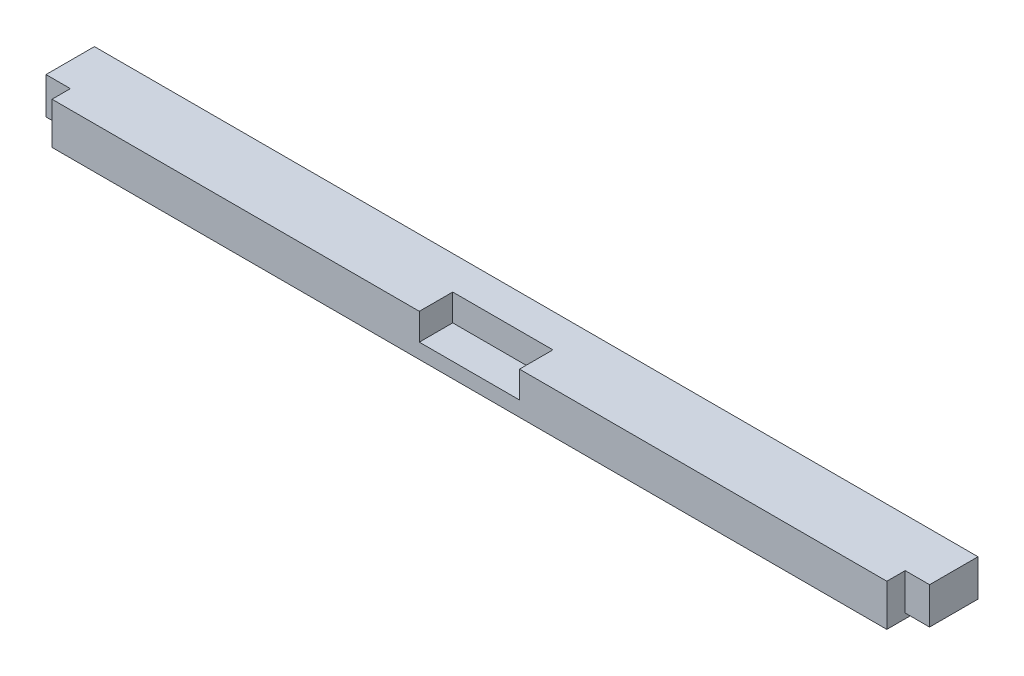
ISO-10303-21;
HEADER;
FILE_DESCRIPTION(('STEP AP214'),'2;1');
FILE_NAME('part.step','',(''),(''),'','','');
FILE_SCHEMA(('AUTOMOTIVE_DESIGN { 1 0 10303 214 1 1 1 1 }'));
ENDSEC;
DATA;
#1=APPLICATION_CONTEXT('core data for automotive mechanical design processes');
#2=APPLICATION_PROTOCOL_DEFINITION('international standard','automotive_design',2000,#1);
#3=PRODUCT_CONTEXT('',#1,'mechanical');
#4=PRODUCT('Part','Part','',(#3));
#5=PRODUCT_RELATED_PRODUCT_CATEGORY('part','',(#4));
#6=PRODUCT_DEFINITION_FORMATION('','',#4);
#7=PRODUCT_DEFINITION_CONTEXT('part definition',#1,'design');
#8=PRODUCT_DEFINITION('design','',#6,#7);
#9=PRODUCT_DEFINITION_SHAPE('','',#8);
#10=(LENGTH_UNIT() NAMED_UNIT(*) SI_UNIT(.MILLI.,.METRE.));
#11=(NAMED_UNIT(*) PLANE_ANGLE_UNIT() SI_UNIT($,.RADIAN.));
#12=(NAMED_UNIT(*) SI_UNIT($,.STERADIAN.) SOLID_ANGLE_UNIT());
#13=UNCERTAINTY_MEASURE_WITH_UNIT(LENGTH_MEASURE(1.E-05),#10,'distance_accuracy_value','');
#14=(GEOMETRIC_REPRESENTATION_CONTEXT(3) GLOBAL_UNCERTAINTY_ASSIGNED_CONTEXT((#13)) GLOBAL_UNIT_ASSIGNED_CONTEXT((#10,
#11,#12)) REPRESENTATION_CONTEXT('',''));
#15=CARTESIAN_POINT('',(0.,0.,0.));
#16=DIRECTION('',(0.,0.,1.));
#17=DIRECTION('',(1.,0.,0.));
#18=AXIS2_PLACEMENT_3D('',#15,#16,#17);
#19=CARTESIAN_POINT('',(0.,31.75,-50.8));
#20=DIRECTION('',(1.,0.,0.));
#21=DIRECTION('',(0.,0.,-1.));
#22=AXIS2_PLACEMENT_3D('',#19,#20,#21);
#23=PLANE('',#22);
#24=DIRECTION('',(0.,1.,0.));
#25=VECTOR('',#24,1.);
#26=CARTESIAN_POINT('',(0.,31.75,-13.97));
#27=LINE('',#26,#25);
#28=CARTESIAN_POINT('',(0.,3.81,-13.97));
#29=VERTEX_POINT('',#28);
#30=CARTESIAN_POINT('',(0.,31.75,-13.97));
#31=VERTEX_POINT('',#30);
#32=EDGE_CURVE('E176',#29,#31,#27,.T.);
#33=ORIENTED_EDGE('',*,*,#32,.F.);
#34=DIRECTION('',(0.,0.,1.));
#35=VECTOR('',#34,1.);
#36=CARTESIAN_POINT('',(0.,3.81,-50.8));
#37=LINE('',#36,#35);
#38=CARTESIAN_POINT('',(0.,3.81,-50.8));
#39=VERTEX_POINT('',#38);
#40=EDGE_CURVE('E55',#39,#29,#37,.T.);
#41=ORIENTED_EDGE('',*,*,#40,.F.);
#42=DIRECTION('',(0.,-1.,0.));
#43=VECTOR('',#42,1.);
#44=CARTESIAN_POINT('',(0.,31.75,-50.8));
#45=LINE('',#44,#43);
#46=CARTESIAN_POINT('',(0.,0.,-50.8));
#47=VERTEX_POINT('',#46);
#48=EDGE_CURVE('E231',#39,#47,#45,.T.);
#49=ORIENTED_EDGE('',*,*,#48,.T.);
#50=DIRECTION('',(0.,0.,1.));
#51=VECTOR('',#50,1.);
#52=CARTESIAN_POINT('',(0.,0.,-50.8));
#53=LINE('',#52,#51);
#54=CARTESIAN_POINT('',(0.,0.,0.));
#55=VERTEX_POINT('',#54);
#56=EDGE_CURVE('E219',#47,#55,#53,.T.);
#57=ORIENTED_EDGE('',*,*,#56,.T.);
#58=DIRECTION('',(0.,-1.,0.));
#59=VECTOR('',#58,1.);
#60=CARTESIAN_POINT('',(0.,31.75,0.));
#61=LINE('',#60,#59);
#62=CARTESIAN_POINT('',(0.,31.75,0.));
#63=VERTEX_POINT('',#62);
#64=EDGE_CURVE('E11',#63,#55,#61,.T.);
#65=ORIENTED_EDGE('',*,*,#64,.F.);
#66=DIRECTION('',(0.,0.,1.));
#67=VECTOR('',#66,1.);
#68=CARTESIAN_POINT('',(0.,31.75,-50.8));
#69=LINE('',#68,#67);
#70=EDGE_CURVE('E220',#31,#63,#69,.T.);
#71=ORIENTED_EDGE('',*,*,#70,.F.);
#72=EDGE_LOOP('',(#33,#41,#49,#57,#65,#71));
#73=FACE_BOUND('',#72,.T.);
#74=ADVANCED_FACE('F33',(#73),#23,.F.);
#75=CARTESIAN_POINT('',(635.,31.75,-50.8));
#76=DIRECTION('',(-1.,0.,0.));
#77=DIRECTION('',(0.,0.,1.));
#78=AXIS2_PLACEMENT_3D('',#75,#76,#77);
#79=PLANE('',#78);
#80=DIRECTION('',(0.,0.,-1.));
#81=VECTOR('',#80,1.);
#82=CARTESIAN_POINT('',(635.,3.81,-50.8));
#83=LINE('',#82,#81);
#84=CARTESIAN_POINT('',(635.,3.81,-13.97));
#85=VERTEX_POINT('',#84);
#86=CARTESIAN_POINT('',(635.,3.81,-50.8));
#87=VERTEX_POINT('',#86);
#88=EDGE_CURVE('E200',#85,#87,#83,.T.);
#89=ORIENTED_EDGE('',*,*,#88,.F.);
#90=DIRECTION('',(0.,-1.,0.));
#91=VECTOR('',#90,1.);
#92=CARTESIAN_POINT('',(635.,31.75,-13.97));
#93=LINE('',#92,#91);
#94=CARTESIAN_POINT('',(635.,31.75,-13.97));
#95=VERTEX_POINT('',#94);
#96=EDGE_CURVE('E195',#95,#85,#93,.T.);
#97=ORIENTED_EDGE('',*,*,#96,.F.);
#98=DIRECTION('',(0.,0.,-1.));
#99=VECTOR('',#98,1.);
#100=CARTESIAN_POINT('',(635.,31.75,-50.8));
#101=LINE('',#100,#99);
#102=CARTESIAN_POINT('',(635.,31.75,0.));
#103=VERTEX_POINT('',#102);
#104=EDGE_CURVE('E226',#103,#95,#101,.T.);
#105=ORIENTED_EDGE('',*,*,#104,.F.);
#106=DIRECTION('',(0.,-1.,0.));
#107=VECTOR('',#106,1.);
#108=CARTESIAN_POINT('',(635.,31.75,0.));
#109=LINE('',#108,#107);
#110=CARTESIAN_POINT('',(635.,0.,0.));
#111=VERTEX_POINT('',#110);
#112=EDGE_CURVE('E40',#103,#111,#109,.T.);
#113=ORIENTED_EDGE('',*,*,#112,.T.);
#114=DIRECTION('',(0.,0.,-1.));
#115=VECTOR('',#114,1.);
#116=CARTESIAN_POINT('',(635.,0.,-50.8));
#117=LINE('',#116,#115);
#118=CARTESIAN_POINT('',(635.,0.,-50.8));
#119=VERTEX_POINT('',#118);
#120=EDGE_CURVE('E236',#111,#119,#117,.T.);
#121=ORIENTED_EDGE('',*,*,#120,.T.);
#122=DIRECTION('',(0.,-1.,0.));
#123=VECTOR('',#122,1.);
#124=CARTESIAN_POINT('',(635.,31.75,-50.8));
#125=LINE('',#124,#123);
#126=EDGE_CURVE('E242',#87,#119,#125,.T.);
#127=ORIENTED_EDGE('',*,*,#126,.F.);
#128=EDGE_LOOP('',(#89,#97,#105,#113,#121,#127));
#129=FACE_BOUND('',#128,.T.);
#130=ADVANCED_FACE('F248',(#129),#79,.F.);
#131=CARTESIAN_POINT('',(0.,31.75,0.));
#132=DIRECTION('',(0.,0.,-1.));
#133=DIRECTION('',(-1.,0.,0.));
#134=AXIS2_PLACEMENT_3D('',#131,#132,#133);
#135=PLANE('',#134);
#136=DIRECTION('',(1.,0.,0.));
#137=VECTOR('',#136,1.);
#138=CARTESIAN_POINT('',(355.6,11.43,0.));
#139=LINE('',#138,#137);
#140=CARTESIAN_POINT('',(279.4,11.43,0.));
#141=VERTEX_POINT('',#140);
#142=CARTESIAN_POINT('',(355.6,11.43,0.));
#143=VERTEX_POINT('',#142);
#144=EDGE_CURVE('E151',#141,#143,#139,.T.);
#145=ORIENTED_EDGE('',*,*,#144,.F.);
#146=DIRECTION('',(0.,1.,0.));
#147=VECTOR('',#146,1.);
#148=CARTESIAN_POINT('',(279.4,11.43,0.));
#149=LINE('',#148,#147);
#150=CARTESIAN_POINT('',(279.4,31.75,0.));
#151=VERTEX_POINT('',#150);
#152=EDGE_CURVE('E134',#141,#151,#149,.T.);
#153=ORIENTED_EDGE('',*,*,#152,.T.);
#154=DIRECTION('',(1.,0.,0.));
#155=VECTOR('',#154,1.);
#156=CARTESIAN_POINT('',(0.,31.75,0.));
#157=LINE('',#156,#155);
#158=EDGE_CURVE('E224',#63,#151,#157,.T.);
#159=ORIENTED_EDGE('',*,*,#158,.F.);
#160=ORIENTED_EDGE('',*,*,#64,.T.);
#161=DIRECTION('',(1.,0.,0.));
#162=VECTOR('',#161,1.);
#163=CARTESIAN_POINT('',(0.,0.,0.));
#164=LINE('',#163,#162);
#165=EDGE_CURVE('E234',#55,#111,#164,.T.);
#166=ORIENTED_EDGE('',*,*,#165,.T.);
#167=ORIENTED_EDGE('',*,*,#112,.F.);
#168=CARTESIAN_POINT('',(355.6,31.75,0.));
#169=VERTEX_POINT('',#168);
#170=EDGE_CURVE('E222',#169,#103,#157,.T.);
#171=ORIENTED_EDGE('',*,*,#170,.F.);
#172=DIRECTION('',(0.,1.,0.));
#173=VECTOR('',#172,1.);
#174=CARTESIAN_POINT('',(355.6,11.43,0.));
#175=LINE('',#174,#173);
#176=EDGE_CURVE('E47',#143,#169,#175,.T.);
#177=ORIENTED_EDGE('',*,*,#176,.F.);
#178=EDGE_LOOP('',(#145,#153,#159,#160,#166,#167,#171,#177));
#179=FACE_BOUND('',#178,.T.);
#180=ADVANCED_FACE('F155',(#179),#135,.F.);
#181=CARTESIAN_POINT('',(0.,31.75,-50.8));
#182=DIRECTION('',(0.,0.,1.));
#183=DIRECTION('',(1.,0.,0.));
#184=AXIS2_PLACEMENT_3D('',#181,#182,#183);
#185=PLANE('',#184);
#186=DIRECTION('',(-1.,0.,0.));
#187=VECTOR('',#186,1.);
#188=CARTESIAN_POINT('',(0.,0.,-50.8));
#189=LINE('',#188,#187);
#190=EDGE_CURVE('E223',#119,#47,#189,.T.);
#191=ORIENTED_EDGE('',*,*,#190,.T.);
#192=ORIENTED_EDGE('',*,*,#48,.F.);
#193=DIRECTION('',(1.,0.,0.));
#194=VECTOR('',#193,1.);
#195=CARTESIAN_POINT('',(-18.542,3.81,-50.8));
#196=LINE('',#195,#194);
#197=CARTESIAN_POINT('',(-18.542,3.81,-50.8));
#198=VERTEX_POINT('',#197);
#199=EDGE_CURVE('E192',#198,#39,#196,.T.);
#200=ORIENTED_EDGE('',*,*,#199,.F.);
#201=DIRECTION('',(0.,-1.,0.));
#202=VECTOR('',#201,1.);
#203=CARTESIAN_POINT('',(-18.542,31.75,-50.8));
#204=LINE('',#203,#202);
#205=CARTESIAN_POINT('',(-18.542,31.75,-50.8));
#206=VERTEX_POINT('',#205);
#207=EDGE_CURVE('E172',#206,#198,#204,.T.);
#208=ORIENTED_EDGE('',*,*,#207,.F.);
#209=DIRECTION('',(-1.,0.,0.));
#210=VECTOR('',#209,1.);
#211=CARTESIAN_POINT('',(0.,31.75,-50.8));
#212=LINE('',#211,#210);
#213=CARTESIAN_POINT('',(653.542,31.75,-50.8));
#214=VERTEX_POINT('',#213);
#215=EDGE_CURVE('E229',#214,#206,#212,.T.);
#216=ORIENTED_EDGE('',*,*,#215,.F.);
#217=DIRECTION('',(0.,1.,0.));
#218=VECTOR('',#217,1.);
#219=CARTESIAN_POINT('',(653.542,31.75,-50.8));
#220=LINE('',#219,#218);
#221=CARTESIAN_POINT('',(653.542,3.81,-50.8));
#222=VERTEX_POINT('',#221);
#223=EDGE_CURVE('E196',#222,#214,#220,.T.);
#224=ORIENTED_EDGE('',*,*,#223,.F.);
#225=DIRECTION('',(-1.,0.,0.));
#226=VECTOR('',#225,1.);
#227=CARTESIAN_POINT('',(653.542,3.81,-50.8));
#228=LINE('',#227,#226);
#229=EDGE_CURVE('E206',#222,#87,#228,.T.);
#230=ORIENTED_EDGE('',*,*,#229,.T.);
#231=ORIENTED_EDGE('',*,*,#126,.T.);
#232=EDGE_LOOP('',(#191,#192,#200,#208,#216,#224,#230,#231));
#233=FACE_BOUND('',#232,.T.);
#234=ADVANCED_FACE('F254',(#233),#185,.F.);
#235=CARTESIAN_POINT('',(0.,31.75,0.));
#236=DIRECTION('',(0.,1.,0.));
#237=DIRECTION('',(0.,0.,1.));
#238=AXIS2_PLACEMENT_3D('',#235,#236,#237);
#239=PLANE('',#238);
#240=DIRECTION('',(0.,0.,1.));
#241=VECTOR('',#240,1.);
#242=CARTESIAN_POINT('',(279.4,31.75,-25.4));
#243=LINE('',#242,#241);
#244=CARTESIAN_POINT('',(279.4,31.75,-25.4));
#245=VERTEX_POINT('',#244);
#246=EDGE_CURVE('E140',#245,#151,#243,.T.);
#247=ORIENTED_EDGE('',*,*,#246,.F.);
#248=DIRECTION('',(-1.,0.,0.));
#249=VECTOR('',#248,1.);
#250=CARTESIAN_POINT('',(355.6,31.75,-25.4));
#251=LINE('',#250,#249);
#252=CARTESIAN_POINT('',(355.6,31.75,-25.4));
#253=VERTEX_POINT('',#252);
#254=EDGE_CURVE('E153',#253,#245,#251,.T.);
#255=ORIENTED_EDGE('',*,*,#254,.F.);
#256=DIRECTION('',(0.,0.,-1.));
#257=VECTOR('',#256,1.);
#258=CARTESIAN_POINT('',(355.6,31.75,-25.4));
#259=LINE('',#258,#257);
#260=EDGE_CURVE('E163',#169,#253,#259,.T.);
#261=ORIENTED_EDGE('',*,*,#260,.F.);
#262=ORIENTED_EDGE('',*,*,#170,.T.);
#263=ORIENTED_EDGE('',*,*,#104,.T.);
#264=DIRECTION('',(-1.,0.,0.));
#265=VECTOR('',#264,1.);
#266=CARTESIAN_POINT('',(653.542,31.75,-13.97));
#267=LINE('',#266,#265);
#268=CARTESIAN_POINT('',(653.542,31.75,-13.97));
#269=VERTEX_POINT('',#268);
#270=EDGE_CURVE('E216',#269,#95,#267,.T.);
#271=ORIENTED_EDGE('',*,*,#270,.F.);
#272=DIRECTION('',(0.,0.,1.));
#273=VECTOR('',#272,1.);
#274=CARTESIAN_POINT('',(653.542,31.75,-50.8));
#275=LINE('',#274,#273);
#276=EDGE_CURVE('E199',#214,#269,#275,.T.);
#277=ORIENTED_EDGE('',*,*,#276,.F.);
#278=ORIENTED_EDGE('',*,*,#215,.T.);
#279=DIRECTION('',(0.,0.,-1.));
#280=VECTOR('',#279,1.);
#281=CARTESIAN_POINT('',(-18.542,31.75,-50.8));
#282=LINE('',#281,#280);
#283=CARTESIAN_POINT('',(-18.542,31.75,-13.97));
#284=VERTEX_POINT('',#283);
#285=EDGE_CURVE('E180',#284,#206,#282,.T.);
#286=ORIENTED_EDGE('',*,*,#285,.F.);
#287=DIRECTION('',(1.,0.,0.));
#288=VECTOR('',#287,1.);
#289=CARTESIAN_POINT('',(-18.542,31.75,-13.97));
#290=LINE('',#289,#288);
#291=EDGE_CURVE('E183',#284,#31,#290,.T.);
#292=ORIENTED_EDGE('',*,*,#291,.T.);
#293=ORIENTED_EDGE('',*,*,#70,.T.);
#294=ORIENTED_EDGE('',*,*,#158,.T.);
#295=EDGE_LOOP('',(#247,#255,#261,#262,#263,#271,#277,#278,#286,#292,#293,#294));
#296=FACE_BOUND('',#295,.T.);
#297=ADVANCED_FACE('F267',(#296),#239,.T.);
#298=CARTESIAN_POINT('',(0.,0.,0.));
#299=DIRECTION('',(0.,1.,0.));
#300=DIRECTION('',(0.,0.,1.));
#301=AXIS2_PLACEMENT_3D('',#298,#299,#300);
#302=PLANE('',#301);
#303=ORIENTED_EDGE('',*,*,#56,.F.);
#304=ORIENTED_EDGE('',*,*,#190,.F.);
#305=ORIENTED_EDGE('',*,*,#120,.F.);
#306=ORIENTED_EDGE('',*,*,#165,.F.);
#307=EDGE_LOOP('',(#303,#304,#305,#306));
#308=FACE_BOUND('',#307,.T.);
#309=ADVANCED_FACE('F252',(#308),#302,.F.);
#310=CARTESIAN_POINT('',(653.542,31.75,-13.97));
#311=DIRECTION('',(0.,0.,-1.));
#312=DIRECTION('',(-1.,0.,0.));
#313=AXIS2_PLACEMENT_3D('',#310,#311,#312);
#314=PLANE('',#313);
#315=ORIENTED_EDGE('',*,*,#96,.T.);
#316=DIRECTION('',(-1.,0.,0.));
#317=VECTOR('',#316,1.);
#318=CARTESIAN_POINT('',(653.542,3.81,-13.97));
#319=LINE('',#318,#317);
#320=CARTESIAN_POINT('',(653.542,3.81,-13.97));
#321=VERTEX_POINT('',#320);
#322=EDGE_CURVE('E213',#321,#85,#319,.T.);
#323=ORIENTED_EDGE('',*,*,#322,.F.);
#324=DIRECTION('',(0.,-1.,0.));
#325=VECTOR('',#324,1.);
#326=CARTESIAN_POINT('',(653.542,31.75,-13.97));
#327=LINE('',#326,#325);
#328=EDGE_CURVE('E202',#269,#321,#327,.T.);
#329=ORIENTED_EDGE('',*,*,#328,.F.);
#330=ORIENTED_EDGE('',*,*,#270,.T.);
#331=EDGE_LOOP('',(#315,#323,#329,#330));
#332=FACE_BOUND('',#331,.T.);
#333=ADVANCED_FACE('F264',(#332),#314,.F.);
#334=CARTESIAN_POINT('',(653.542,3.81,-50.8));
#335=DIRECTION('',(0.,1.,0.));
#336=DIRECTION('',(0.,0.,1.));
#337=AXIS2_PLACEMENT_3D('',#334,#335,#336);
#338=PLANE('',#337);
#339=ORIENTED_EDGE('',*,*,#88,.T.);
#340=ORIENTED_EDGE('',*,*,#229,.F.);
#341=DIRECTION('',(0.,0.,-1.));
#342=VECTOR('',#341,1.);
#343=CARTESIAN_POINT('',(653.542,3.81,-50.8));
#344=LINE('',#343,#342);
#345=EDGE_CURVE('E204',#321,#222,#344,.T.);
#346=ORIENTED_EDGE('',*,*,#345,.F.);
#347=ORIENTED_EDGE('',*,*,#322,.T.);
#348=EDGE_LOOP('',(#339,#340,#346,#347));
#349=FACE_BOUND('',#348,.T.);
#350=ADVANCED_FACE('F259',(#349),#338,.F.);
#351=CARTESIAN_POINT('',(653.542,0.,0.));
#352=DIRECTION('',(-1.,0.,0.));
#353=DIRECTION('',(0.,0.,1.));
#354=AXIS2_PLACEMENT_3D('',#351,#352,#353);
#355=PLANE('',#354);
#356=ORIENTED_EDGE('',*,*,#223,.T.);
#357=ORIENTED_EDGE('',*,*,#276,.T.);
#358=ORIENTED_EDGE('',*,*,#328,.T.);
#359=ORIENTED_EDGE('',*,*,#345,.T.);
#360=EDGE_LOOP('',(#356,#357,#358,#359));
#361=FACE_BOUND('',#360,.T.);
#362=ADVANCED_FACE('F286',(#361),#355,.F.);
#363=CARTESIAN_POINT('',(-18.542,3.81,-50.8));
#364=DIRECTION('',(0.,1.,0.));
#365=DIRECTION('',(0.,0.,1.));
#366=AXIS2_PLACEMENT_3D('',#363,#364,#365);
#367=PLANE('',#366);
#368=ORIENTED_EDGE('',*,*,#40,.T.);
#369=DIRECTION('',(1.,0.,0.));
#370=VECTOR('',#369,1.);
#371=CARTESIAN_POINT('',(-18.542,3.81,-13.97));
#372=LINE('',#371,#370);
#373=CARTESIAN_POINT('',(-18.542,3.81,-13.97));
#374=VERTEX_POINT('',#373);
#375=EDGE_CURVE('E189',#374,#29,#372,.T.);
#376=ORIENTED_EDGE('',*,*,#375,.F.);
#377=DIRECTION('',(0.,0.,1.));
#378=VECTOR('',#377,1.);
#379=CARTESIAN_POINT('',(-18.542,3.81,-50.8));
#380=LINE('',#379,#378);
#381=EDGE_CURVE('E175',#198,#374,#380,.T.);
#382=ORIENTED_EDGE('',*,*,#381,.F.);
#383=ORIENTED_EDGE('',*,*,#199,.T.);
#384=EDGE_LOOP('',(#368,#376,#382,#383));
#385=FACE_BOUND('',#384,.T.);
#386=ADVANCED_FACE('F284',(#385),#367,.F.);
#387=CARTESIAN_POINT('',(-18.542,31.75,-13.97));
#388=DIRECTION('',(0.,0.,-1.));
#389=DIRECTION('',(-1.,0.,0.));
#390=AXIS2_PLACEMENT_3D('',#387,#388,#389);
#391=PLANE('',#390);
#392=ORIENTED_EDGE('',*,*,#32,.T.);
#393=ORIENTED_EDGE('',*,*,#291,.F.);
#394=DIRECTION('',(0.,1.,0.));
#395=VECTOR('',#394,1.);
#396=CARTESIAN_POINT('',(-18.542,31.75,-13.97));
#397=LINE('',#396,#395);
#398=EDGE_CURVE('E178',#374,#284,#397,.T.);
#399=ORIENTED_EDGE('',*,*,#398,.F.);
#400=ORIENTED_EDGE('',*,*,#375,.T.);
#401=EDGE_LOOP('',(#392,#393,#399,#400));
#402=FACE_BOUND('',#401,.T.);
#403=ADVANCED_FACE('F276',(#402),#391,.F.);
#404=CARTESIAN_POINT('',(-18.542,0.,0.));
#405=DIRECTION('',(-1.,0.,0.));
#406=DIRECTION('',(0.,0.,1.));
#407=AXIS2_PLACEMENT_3D('',#404,#405,#406);
#408=PLANE('',#407);
#409=ORIENTED_EDGE('',*,*,#207,.T.);
#410=ORIENTED_EDGE('',*,*,#381,.T.);
#411=ORIENTED_EDGE('',*,*,#398,.T.);
#412=ORIENTED_EDGE('',*,*,#285,.T.);
#413=EDGE_LOOP('',(#409,#410,#411,#412));
#414=FACE_BOUND('',#413,.T.);
#415=ADVANCED_FACE('F282',(#414),#408,.T.);
#416=CARTESIAN_POINT('',(279.4,11.43,-25.4));
#417=DIRECTION('',(-1.,0.,0.));
#418=DIRECTION('',(0.,0.,1.));
#419=AXIS2_PLACEMENT_3D('',#416,#417,#418);
#420=PLANE('',#419);
#421=ORIENTED_EDGE('',*,*,#246,.T.);
#422=ORIENTED_EDGE('',*,*,#152,.F.);
#423=DIRECTION('',(0.,0.,1.));
#424=VECTOR('',#423,1.);
#425=CARTESIAN_POINT('',(279.4,11.43,-25.4));
#426=LINE('',#425,#424);
#427=CARTESIAN_POINT('',(279.4,11.43,-25.4));
#428=VERTEX_POINT('',#427);
#429=EDGE_CURVE('E137',#428,#141,#426,.T.);
#430=ORIENTED_EDGE('',*,*,#429,.F.);
#431=DIRECTION('',(0.,1.,0.));
#432=VECTOR('',#431,1.);
#433=CARTESIAN_POINT('',(279.4,11.43,-25.4));
#434=LINE('',#433,#432);
#435=EDGE_CURVE('E167',#428,#245,#434,.T.);
#436=ORIENTED_EDGE('',*,*,#435,.T.);
#437=EDGE_LOOP('',(#421,#422,#430,#436));
#438=FACE_BOUND('',#437,.T.);
#439=ADVANCED_FACE('F136',(#438),#420,.F.);
#440=CARTESIAN_POINT('',(355.6,11.43,-25.4));
#441=DIRECTION('',(0.,0.,-1.));
#442=DIRECTION('',(-1.,0.,0.));
#443=AXIS2_PLACEMENT_3D('',#440,#441,#442);
#444=PLANE('',#443);
#445=ORIENTED_EDGE('',*,*,#254,.T.);
#446=ORIENTED_EDGE('',*,*,#435,.F.);
#447=DIRECTION('',(-1.,0.,0.));
#448=VECTOR('',#447,1.);
#449=CARTESIAN_POINT('',(355.6,11.43,-25.4));
#450=LINE('',#449,#448);
#451=CARTESIAN_POINT('',(355.6,11.43,-25.4));
#452=VERTEX_POINT('',#451);
#453=EDGE_CURVE('E145',#452,#428,#450,.T.);
#454=ORIENTED_EDGE('',*,*,#453,.F.);
#455=DIRECTION('',(0.,1.,0.));
#456=VECTOR('',#455,1.);
#457=CARTESIAN_POINT('',(355.6,11.43,-25.4));
#458=LINE('',#457,#456);
#459=EDGE_CURVE('E169',#452,#253,#458,.T.);
#460=ORIENTED_EDGE('',*,*,#459,.T.);
#461=EDGE_LOOP('',(#445,#446,#454,#460));
#462=FACE_BOUND('',#461,.T.);
#463=ADVANCED_FACE('F272',(#462),#444,.F.);
#464=CARTESIAN_POINT('',(355.6,11.43,-25.4));
#465=DIRECTION('',(1.,0.,0.));
#466=DIRECTION('',(0.,0.,-1.));
#467=AXIS2_PLACEMENT_3D('',#464,#465,#466);
#468=PLANE('',#467);
#469=ORIENTED_EDGE('',*,*,#260,.T.);
#470=ORIENTED_EDGE('',*,*,#459,.F.);
#471=DIRECTION('',(0.,0.,-1.));
#472=VECTOR('',#471,1.);
#473=CARTESIAN_POINT('',(355.6,11.43,-25.4));
#474=LINE('',#473,#472);
#475=EDGE_CURVE('E157',#143,#452,#474,.T.);
#476=ORIENTED_EDGE('',*,*,#475,.F.);
#477=ORIENTED_EDGE('',*,*,#176,.T.);
#478=EDGE_LOOP('',(#469,#470,#476,#477));
#479=FACE_BOUND('',#478,.T.);
#480=ADVANCED_FACE('F270',(#479),#468,.F.);
#481=CARTESIAN_POINT('',(0.,11.43,0.));
#482=DIRECTION('',(0.,-1.,0.));
#483=DIRECTION('',(0.,0.,-1.));
#484=AXIS2_PLACEMENT_3D('',#481,#482,#483);
#485=PLANE('',#484);
#486=ORIENTED_EDGE('',*,*,#429,.T.);
#487=ORIENTED_EDGE('',*,*,#144,.T.);
#488=ORIENTED_EDGE('',*,*,#475,.T.);
#489=ORIENTED_EDGE('',*,*,#453,.T.);
#490=EDGE_LOOP('',(#486,#487,#488,#489));
#491=FACE_BOUND('',#490,.T.);
#492=ADVANCED_FACE('F149',(#491),#485,.F.);
#493=CLOSED_SHELL('',(#74,#130,#180,#234,#297,#309,#333,#350,#362,#386,#403,#415,#439,#463,#480,#492));
#494=MANIFOLD_SOLID_BREP('B2',#493);
#495=ADVANCED_BREP_SHAPE_REPRESENTATION('',(#18,#494),#14);
#496=SHAPE_DEFINITION_REPRESENTATION(#9,#495);
ENDSEC;
END-ISO-10303-21;
